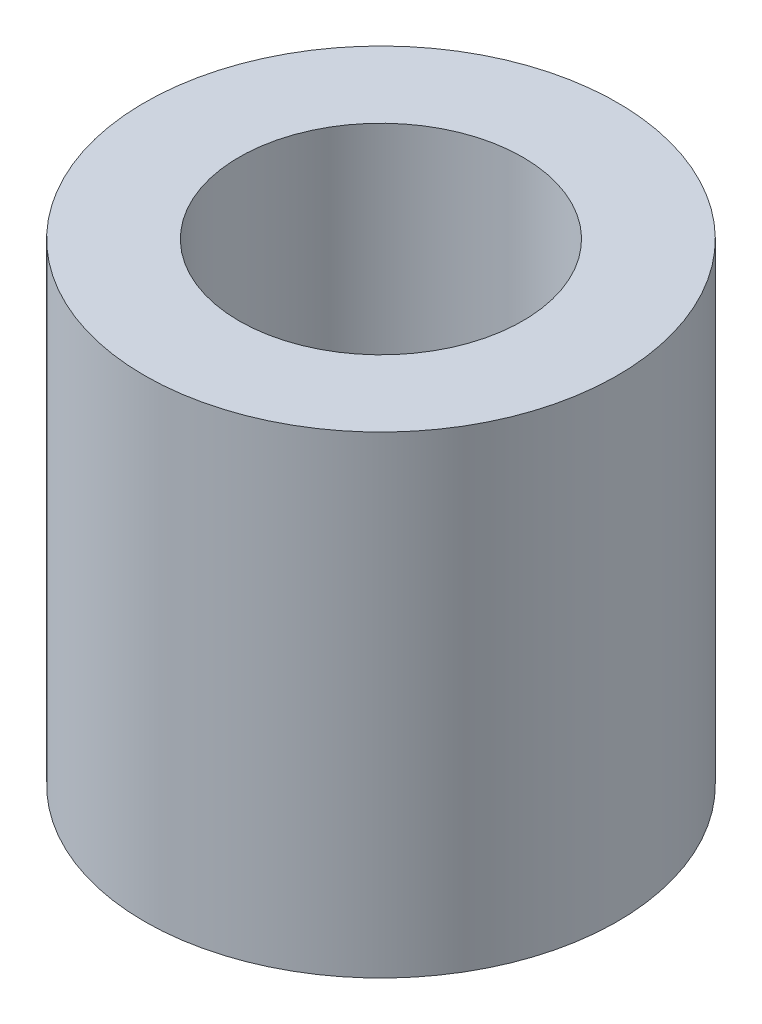
ISO-10303-21;
HEADER;
FILE_DESCRIPTION(('STEP AP214'),'2;1');
FILE_NAME('part.step','',(''),(''),'','','');
FILE_SCHEMA(('AUTOMOTIVE_DESIGN { 1 0 10303 214 1 1 1 1 }'));
ENDSEC;
DATA;
#1=APPLICATION_CONTEXT('core data for automotive mechanical design processes');
#2=APPLICATION_PROTOCOL_DEFINITION('international standard','automotive_design',2000,#1);
#3=PRODUCT_CONTEXT('',#1,'mechanical');
#4=PRODUCT('Part','Part','',(#3));
#5=PRODUCT_RELATED_PRODUCT_CATEGORY('part','',(#4));
#6=PRODUCT_DEFINITION_FORMATION('','',#4);
#7=PRODUCT_DEFINITION_CONTEXT('part definition',#1,'design');
#8=PRODUCT_DEFINITION('design','',#6,#7);
#9=PRODUCT_DEFINITION_SHAPE('','',#8);
#10=(LENGTH_UNIT() NAMED_UNIT(*) SI_UNIT(.MILLI.,.METRE.));
#11=(NAMED_UNIT(*) PLANE_ANGLE_UNIT() SI_UNIT($,.RADIAN.));
#12=(NAMED_UNIT(*) SI_UNIT($,.STERADIAN.) SOLID_ANGLE_UNIT());
#13=UNCERTAINTY_MEASURE_WITH_UNIT(LENGTH_MEASURE(1.E-05),#10,'distance_accuracy_value','');
#14=(GEOMETRIC_REPRESENTATION_CONTEXT(3) GLOBAL_UNCERTAINTY_ASSIGNED_CONTEXT((#13)) GLOBAL_UNIT_ASSIGNED_CONTEXT((#10,
#11,#12)) REPRESENTATION_CONTEXT('',''));
#15=CARTESIAN_POINT('',(0.,0.,0.));
#16=DIRECTION('',(0.,0.,1.));
#17=DIRECTION('',(1.,0.,0.));
#18=AXIS2_PLACEMENT_3D('',#15,#16,#17);
#19=CARTESIAN_POINT('',(0.,10.,0.));
#20=DIRECTION('',(0.,-1.,0.));
#21=DIRECTION('',(0.,0.,-1.));
#22=AXIS2_PLACEMENT_3D('',#19,#20,#21);
#23=CYLINDRICAL_SURFACE('',#22,5.);
#24=CARTESIAN_POINT('',(0.,10.,0.));
#25=DIRECTION('',(0.,1.,0.));
#26=DIRECTION('',(0.,0.,1.));
#27=AXIS2_PLACEMENT_3D('',#24,#25,#26);
#28=CIRCLE('',#27,5.);
#29=CARTESIAN_POINT('',(0.,10.,5.));
#30=VERTEX_POINT('',#29);
#31=EDGE_CURVE('E10',#30,#30,#28,.T.);
#32=ORIENTED_EDGE('',*,*,#31,.F.);
#33=EDGE_LOOP('',(#32));
#34=FACE_BOUND('',#33,.T.);
#35=CARTESIAN_POINT('',(0.,0.,0.));
#36=DIRECTION('',(0.,1.,0.));
#37=DIRECTION('',(0.,0.,1.));
#38=AXIS2_PLACEMENT_3D('',#35,#36,#37);
#39=CIRCLE('',#38,5.);
#40=CARTESIAN_POINT('',(0.,0.,5.));
#41=VERTEX_POINT('',#40);
#42=EDGE_CURVE('E37',#41,#41,#39,.T.);
#43=ORIENTED_EDGE('',*,*,#42,.T.);
#44=EDGE_LOOP('',(#43));
#45=FACE_BOUND('',#44,.T.);
#46=ADVANCED_FACE('F34',(#34,#45),#23,.T.);
#47=CARTESIAN_POINT('',(0.,10.,0.));
#48=DIRECTION('',(0.,1.,0.));
#49=DIRECTION('',(0.,0.,1.));
#50=AXIS2_PLACEMENT_3D('',#47,#48,#49);
#51=PLANE('',#50);
#52=CARTESIAN_POINT('',(0.,10.,0.));
#53=DIRECTION('',(0.,1.,0.));
#54=DIRECTION('',(0.,0.,1.));
#55=AXIS2_PLACEMENT_3D('',#52,#53,#54);
#56=CIRCLE('',#55,3.);
#57=CARTESIAN_POINT('',(0.,10.,3.));
#58=VERTEX_POINT('',#57);
#59=EDGE_CURVE('E44',#58,#58,#56,.T.);
#60=ORIENTED_EDGE('',*,*,#59,.F.);
#61=EDGE_LOOP('',(#60));
#62=FACE_BOUND('',#61,.T.);
#63=ORIENTED_EDGE('',*,*,#31,.T.);
#64=EDGE_LOOP('',(#63));
#65=FACE_BOUND('',#64,.T.);
#66=ADVANCED_FACE('F64',(#62,#65),#51,.T.);
#67=CARTESIAN_POINT('',(0.,0.,0.));
#68=DIRECTION('',(0.,1.,0.));
#69=DIRECTION('',(0.,0.,1.));
#70=AXIS2_PLACEMENT_3D('',#67,#68,#69);
#71=PLANE('',#70);
#72=ORIENTED_EDGE('',*,*,#42,.F.);
#73=EDGE_LOOP('',(#72));
#74=FACE_BOUND('',#73,.T.);
#75=ADVANCED_FACE('F56',(#74),#71,.F.);
#76=CARTESIAN_POINT('',(0.,10.,0.));
#77=DIRECTION('',(0.,-1.,0.));
#78=DIRECTION('',(0.,0.,-1.));
#79=AXIS2_PLACEMENT_3D('',#76,#77,#78);
#80=CYLINDRICAL_SURFACE('',#79,3.);
#81=ORIENTED_EDGE('',*,*,#59,.T.);
#82=EDGE_LOOP('',(#81));
#83=FACE_BOUND('',#82,.T.);
#84=CARTESIAN_POINT('',(0.,2.,0.));
#85=DIRECTION('',(0.,1.,0.));
#86=DIRECTION('',(0.,0.,1.));
#87=AXIS2_PLACEMENT_3D('',#84,#85,#86);
#88=CIRCLE('',#87,3.);
#89=CARTESIAN_POINT('',(0.,2.,3.));
#90=VERTEX_POINT('',#89);
#91=EDGE_CURVE('E48',#90,#90,#88,.T.);
#92=ORIENTED_EDGE('',*,*,#91,.F.);
#93=EDGE_LOOP('',(#92));
#94=FACE_BOUND('',#93,.T.);
#95=ADVANCED_FACE('F54',(#83,#94),#80,.F.);
#96=CARTESIAN_POINT('',(0.,2.,0.));
#97=DIRECTION('',(0.,1.,0.));
#98=DIRECTION('',(0.,0.,1.));
#99=AXIS2_PLACEMENT_3D('',#96,#97,#98);
#100=PLANE('',#99);
#101=ORIENTED_EDGE('',*,*,#91,.T.);
#102=EDGE_LOOP('',(#101));
#103=FACE_BOUND('',#102,.T.);
#104=ADVANCED_FACE('F52',(#103),#100,.T.);
#105=CLOSED_SHELL('',(#46,#66,#75,#95,#104));
#106=MANIFOLD_SOLID_BREP('B2',#105);
#107=ADVANCED_BREP_SHAPE_REPRESENTATION('',(#18,#106),#14);
#108=SHAPE_DEFINITION_REPRESENTATION(#9,#107);
ENDSEC;
END-ISO-10303-21;
